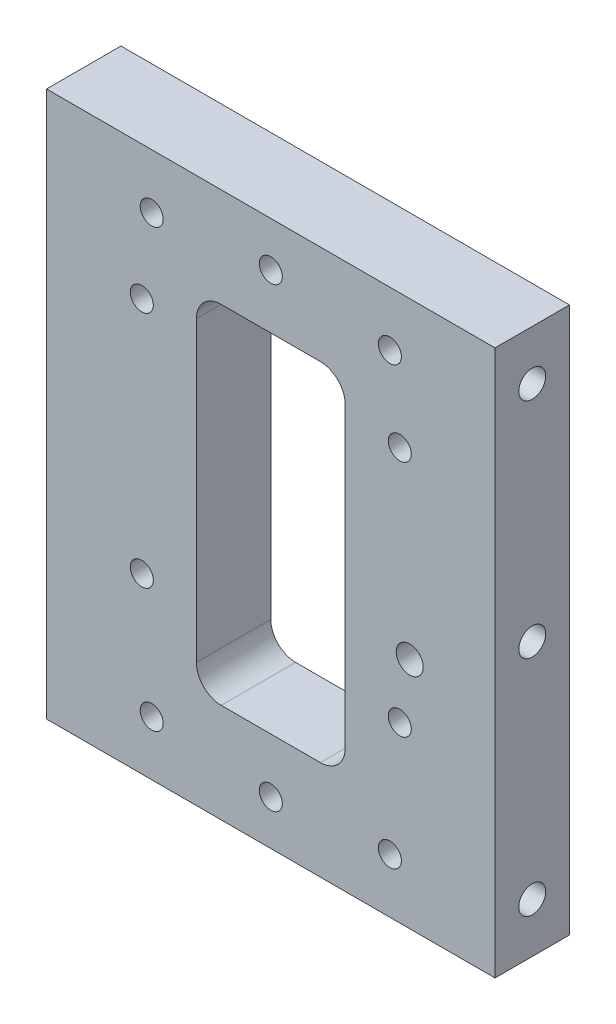
ISO-10303-21;
HEADER;
FILE_DESCRIPTION(('STEP AP214'),'2;1');
FILE_NAME('part.step','',(''),(''),'','','');
FILE_SCHEMA(('AUTOMOTIVE_DESIGN { 1 0 10303 214 1 1 1 1 }'));
ENDSEC;
DATA;
#1=APPLICATION_CONTEXT('core data for automotive mechanical design processes');
#2=APPLICATION_PROTOCOL_DEFINITION('international standard','automotive_design',2000,#1);
#3=PRODUCT_CONTEXT('',#1,'mechanical');
#4=PRODUCT('Part','Part','',(#3));
#5=PRODUCT_RELATED_PRODUCT_CATEGORY('part','',(#4));
#6=PRODUCT_DEFINITION_FORMATION('','',#4);
#7=PRODUCT_DEFINITION_CONTEXT('part definition',#1,'design');
#8=PRODUCT_DEFINITION('design','',#6,#7);
#9=PRODUCT_DEFINITION_SHAPE('','',#8);
#10=(LENGTH_UNIT() NAMED_UNIT(*) SI_UNIT(.MILLI.,.METRE.));
#11=(NAMED_UNIT(*) PLANE_ANGLE_UNIT() SI_UNIT($,.RADIAN.));
#12=(NAMED_UNIT(*) SI_UNIT($,.STERADIAN.) SOLID_ANGLE_UNIT());
#13=UNCERTAINTY_MEASURE_WITH_UNIT(LENGTH_MEASURE(1.E-05),#10,'distance_accuracy_value','');
#14=(GEOMETRIC_REPRESENTATION_CONTEXT(3) GLOBAL_UNCERTAINTY_ASSIGNED_CONTEXT((#13)) GLOBAL_UNIT_ASSIGNED_CONTEXT((#10,
#11,#12)) REPRESENTATION_CONTEXT('',''));
#15=CARTESIAN_POINT('',(0.,0.,0.));
#16=DIRECTION('',(0.,0.,1.));
#17=DIRECTION('',(1.,0.,0.));
#18=AXIS2_PLACEMENT_3D('',#15,#16,#17);
#19=CARTESIAN_POINT('',(-19.05,34.925,4.7625));
#20=DIRECTION('',(0.,-1.,0.));
#21=DIRECTION('',(0.,0.,-1.));
#22=AXIS2_PLACEMENT_3D('',#19,#20,#21);
#23=PLANE('',#22);
#24=DIRECTION('',(-1.,0.,0.));
#25=VECTOR('',#24,1.);
#26=CARTESIAN_POINT('',(-19.05,34.925,-4.7625));
#27=LINE('',#26,#25);
#28=CARTESIAN_POINT('',(28.702,34.925,-4.7625));
#29=VERTEX_POINT('',#28);
#30=CARTESIAN_POINT('',(-28.702,34.925,-4.7625));
#31=VERTEX_POINT('',#30);
#32=EDGE_CURVE('E274',#29,#31,#27,.T.);
#33=ORIENTED_EDGE('',*,*,#32,.T.);
#34=DIRECTION('',(0.,0.,-1.));
#35=VECTOR('',#34,1.);
#36=CARTESIAN_POINT('',(-28.702,34.925,76.4220178884145));
#37=LINE('',#36,#35);
#38=CARTESIAN_POINT('',(-28.702,34.925,4.7625));
#39=VERTEX_POINT('',#38);
#40=EDGE_CURVE('E207',#39,#31,#37,.T.);
#41=ORIENTED_EDGE('',*,*,#40,.F.);
#42=DIRECTION('',(-1.,0.,0.));
#43=VECTOR('',#42,1.);
#44=CARTESIAN_POINT('',(-19.05,34.925,4.7625));
#45=LINE('',#44,#43);
#46=CARTESIAN_POINT('',(28.702,34.925,4.7625));
#47=VERTEX_POINT('',#46);
#48=EDGE_CURVE('E275',#47,#39,#45,.T.);
#49=ORIENTED_EDGE('',*,*,#48,.F.);
#50=DIRECTION('',(0.,0.,-1.));
#51=VECTOR('',#50,1.);
#52=CARTESIAN_POINT('',(28.702,34.925,76.4220178884145));
#53=LINE('',#52,#51);
#54=EDGE_CURVE('E195',#47,#29,#53,.T.);
#55=ORIENTED_EDGE('',*,*,#54,.T.);
#56=EDGE_LOOP('',(#33,#41,#49,#55));
#57=FACE_BOUND('',#56,.T.);
#58=ADVANCED_FACE('F37',(#57),#23,.F.);
#59=CARTESIAN_POINT('',(-19.05,-34.925,4.7625));
#60=DIRECTION('',(0.,1.,0.));
#61=DIRECTION('',(0.,0.,1.));
#62=AXIS2_PLACEMENT_3D('',#59,#60,#61);
#63=PLANE('',#62);
#64=DIRECTION('',(1.,0.,0.));
#65=VECTOR('',#64,1.);
#66=CARTESIAN_POINT('',(-19.05,-34.925,4.7625));
#67=LINE('',#66,#65);
#68=CARTESIAN_POINT('',(-28.702,-34.925,4.7625));
#69=VERTEX_POINT('',#68);
#70=CARTESIAN_POINT('',(28.702,-34.925,4.7625));
#71=VERTEX_POINT('',#70);
#72=EDGE_CURVE('E277',#69,#71,#67,.T.);
#73=ORIENTED_EDGE('',*,*,#72,.F.);
#74=DIRECTION('',(0.,0.,-1.));
#75=VECTOR('',#74,1.);
#76=CARTESIAN_POINT('',(-28.702,-34.925,76.4220178884145));
#77=LINE('',#76,#75);
#78=CARTESIAN_POINT('',(-28.702,-34.925,-4.7625));
#79=VERTEX_POINT('',#78);
#80=EDGE_CURVE('E210',#69,#79,#77,.T.);
#81=ORIENTED_EDGE('',*,*,#80,.T.);
#82=DIRECTION('',(1.,0.,0.));
#83=VECTOR('',#82,1.);
#84=CARTESIAN_POINT('',(-19.05,-34.925,-4.7625));
#85=LINE('',#84,#83);
#86=CARTESIAN_POINT('',(28.702,-34.925,-4.7625));
#87=VERTEX_POINT('',#86);
#88=EDGE_CURVE('E278',#79,#87,#85,.T.);
#89=ORIENTED_EDGE('',*,*,#88,.T.);
#90=DIRECTION('',(0.,0.,-1.));
#91=VECTOR('',#90,1.);
#92=CARTESIAN_POINT('',(28.702,-34.925,76.4220178884145));
#93=LINE('',#92,#91);
#94=EDGE_CURVE('E198',#71,#87,#93,.T.);
#95=ORIENTED_EDGE('',*,*,#94,.F.);
#96=EDGE_LOOP('',(#73,#81,#89,#95));
#97=FACE_BOUND('',#96,.T.);
#98=ADVANCED_FACE('F373',(#97),#63,.F.);
#99=CARTESIAN_POINT('',(19.05,34.925,4.7625));
#100=DIRECTION('',(0.,0.,-1.));
#101=DIRECTION('',(-1.,0.,0.));
#102=AXIS2_PLACEMENT_3D('',#99,#100,#101);
#103=PLANE('',#102);
#104=CARTESIAN_POINT('',(17.78,-5.08,4.7625));
#105=DIRECTION('',(0.,0.,-1.));
#106=DIRECTION('',(-1.,0.,0.));
#107=AXIS2_PLACEMENT_3D('',#104,#105,#106);
#108=CIRCLE('',#107,1.7272);
#109=CARTESIAN_POINT('',(16.0528,-5.08,4.7625));
#110=VERTEX_POINT('',#109);
#111=EDGE_CURVE('E345',#110,#110,#108,.T.);
#112=ORIENTED_EDGE('',*,*,#111,.T.);
#113=EDGE_LOOP('',(#112));
#114=FACE_BOUND('',#113,.T.);
#115=DIRECTION('',(0.,-1.,0.));
#116=VECTOR('',#115,1.);
#117=CARTESIAN_POINT('',(9.525,22.225,4.7625));
#118=LINE('',#117,#116);
#119=CARTESIAN_POINT('',(9.525,19.05,4.7625));
#120=VERTEX_POINT('',#119);
#121=CARTESIAN_POINT('',(9.525,-19.05,4.7625));
#122=VERTEX_POINT('',#121);
#123=EDGE_CURVE('E331',#120,#122,#118,.T.);
#124=ORIENTED_EDGE('',*,*,#123,.T.);
#125=CARTESIAN_POINT('',(6.35,-19.05,4.7625));
#126=DIRECTION('',(0.,0.,-1.));
#127=DIRECTION('',(-1.,0.,0.));
#128=AXIS2_PLACEMENT_3D('',#125,#126,#127);
#129=CIRCLE('',#128,3.175);
#130=CARTESIAN_POINT('',(6.35,-22.225,4.7625));
#131=VERTEX_POINT('',#130);
#132=EDGE_CURVE('E303',#122,#131,#129,.T.);
#133=ORIENTED_EDGE('',*,*,#132,.T.);
#134=DIRECTION('',(-1.,0.,0.));
#135=VECTOR('',#134,1.);
#136=CARTESIAN_POINT('',(9.525,-22.225,4.7625));
#137=LINE('',#136,#135);
#138=CARTESIAN_POINT('',(-6.34999999999999,-22.225,4.7625));
#139=VERTEX_POINT('',#138);
#140=EDGE_CURVE('E160',#131,#139,#137,.T.);
#141=ORIENTED_EDGE('',*,*,#140,.T.);
#142=CARTESIAN_POINT('',(-6.35,-19.05,4.7625));
#143=DIRECTION('',(0.,0.,-1.));
#144=DIRECTION('',(-1.,0.,0.));
#145=AXIS2_PLACEMENT_3D('',#142,#143,#144);
#146=CIRCLE('',#145,3.175);
#147=CARTESIAN_POINT('',(-9.525,-19.05,4.7625));
#148=VERTEX_POINT('',#147);
#149=EDGE_CURVE('E307',#139,#148,#146,.T.);
#150=ORIENTED_EDGE('',*,*,#149,.T.);
#151=DIRECTION('',(0.,1.,0.));
#152=VECTOR('',#151,1.);
#153=CARTESIAN_POINT('',(-9.525,22.225,4.7625));
#154=LINE('',#153,#152);
#155=CARTESIAN_POINT('',(-9.525,19.05,4.7625));
#156=VERTEX_POINT('',#155);
#157=EDGE_CURVE('E340',#148,#156,#154,.T.);
#158=ORIENTED_EDGE('',*,*,#157,.T.);
#159=CARTESIAN_POINT('',(-6.35,19.05,4.7625));
#160=DIRECTION('',(0.,0.,-1.));
#161=DIRECTION('',(-1.,0.,0.));
#162=AXIS2_PLACEMENT_3D('',#159,#160,#161);
#163=CIRCLE('',#162,3.175);
#164=CARTESIAN_POINT('',(-6.34999999999999,22.225,4.7625));
#165=VERTEX_POINT('',#164);
#166=EDGE_CURVE('E59',#156,#165,#163,.T.);
#167=ORIENTED_EDGE('',*,*,#166,.T.);
#168=DIRECTION('',(1.,0.,0.));
#169=VECTOR('',#168,1.);
#170=CARTESIAN_POINT('',(9.525,22.225,4.7625));
#171=LINE('',#170,#169);
#172=CARTESIAN_POINT('',(6.35,22.225,4.7625));
#173=VERTEX_POINT('',#172);
#174=EDGE_CURVE('E333',#165,#173,#171,.T.);
#175=ORIENTED_EDGE('',*,*,#174,.T.);
#176=CARTESIAN_POINT('',(6.35,19.05,4.7625));
#177=DIRECTION('',(0.,0.,-1.));
#178=DIRECTION('',(-1.,0.,0.));
#179=AXIS2_PLACEMENT_3D('',#176,#177,#178);
#180=CIRCLE('',#179,3.175);
#181=EDGE_CURVE('E11',#173,#120,#180,.T.);
#182=ORIENTED_EDGE('',*,*,#181,.T.);
#183=EDGE_LOOP('',(#124,#133,#141,#150,#158,#167,#175,#182));
#184=FACE_BOUND('',#183,.T.);
#185=DIRECTION('',(0.,-1.,0.));
#186=VECTOR('',#185,1.);
#187=CARTESIAN_POINT('',(-28.702,-34.925,4.7625));
#188=LINE('',#187,#186);
#189=EDGE_CURVE('E203',#39,#69,#188,.T.);
#190=ORIENTED_EDGE('',*,*,#189,.T.);
#191=ORIENTED_EDGE('',*,*,#72,.T.);
#192=DIRECTION('',(0.,1.,0.));
#193=VECTOR('',#192,1.);
#194=CARTESIAN_POINT('',(28.702,-34.925,4.7625));
#195=LINE('',#194,#193);
#196=EDGE_CURVE('E191',#71,#47,#195,.T.);
#197=ORIENTED_EDGE('',*,*,#196,.T.);
#198=ORIENTED_EDGE('',*,*,#48,.T.);
#199=EDGE_LOOP('',(#190,#191,#197,#198));
#200=FACE_BOUND('',#199,.T.);
#201=CARTESIAN_POINT('',(0.,29.21,4.7625));
#202=DIRECTION('',(0.,0.,1.));
#203=DIRECTION('',(1.,0.,0.));
#204=AXIS2_PLACEMENT_3D('',#201,#202,#203);
#205=CIRCLE('',#204,1.47319999999999);
#206=CARTESIAN_POINT('',(1.47319999999999,29.21,4.7625));
#207=VERTEX_POINT('',#206);
#208=EDGE_CURVE('E206',#207,#207,#205,.T.);
#209=ORIENTED_EDGE('',*,*,#208,.F.);
#210=EDGE_LOOP('',(#209));
#211=FACE_BOUND('',#210,.T.);
#212=CARTESIAN_POINT('',(-15.24,27.94,4.7625));
#213=DIRECTION('',(0.,0.,1.));
#214=DIRECTION('',(1.,0.,0.));
#215=AXIS2_PLACEMENT_3D('',#212,#213,#214);
#216=CIRCLE('',#215,1.47319999999999);
#217=CARTESIAN_POINT('',(-13.7668,27.94,4.7625));
#218=VERTEX_POINT('',#217);
#219=EDGE_CURVE('E220',#218,#218,#216,.T.);
#220=ORIENTED_EDGE('',*,*,#219,.F.);
#221=EDGE_LOOP('',(#220));
#222=FACE_BOUND('',#221,.T.);
#223=CARTESIAN_POINT('',(15.24,27.94,4.7625));
#224=DIRECTION('',(0.,0.,1.));
#225=DIRECTION('',(1.,0.,0.));
#226=AXIS2_PLACEMENT_3D('',#223,#224,#225);
#227=CIRCLE('',#226,1.47319999999999);
#228=CARTESIAN_POINT('',(16.7132,27.94,4.7625));
#229=VERTEX_POINT('',#228);
#230=EDGE_CURVE('E226',#229,#229,#227,.T.);
#231=ORIENTED_EDGE('',*,*,#230,.F.);
#232=EDGE_LOOP('',(#231));
#233=FACE_BOUND('',#232,.T.);
#234=CARTESIAN_POINT('',(-15.24,-27.94,4.7625));
#235=DIRECTION('',(0.,0.,1.));
#236=DIRECTION('',(1.,0.,0.));
#237=AXIS2_PLACEMENT_3D('',#234,#235,#236);
#238=CIRCLE('',#237,1.47319999999999);
#239=CARTESIAN_POINT('',(-13.7668,-27.94,4.7625));
#240=VERTEX_POINT('',#239);
#241=EDGE_CURVE('E232',#240,#240,#238,.T.);
#242=ORIENTED_EDGE('',*,*,#241,.F.);
#243=EDGE_LOOP('',(#242));
#244=FACE_BOUND('',#243,.T.);
#245=CARTESIAN_POINT('',(15.24,-27.94,4.7625));
#246=DIRECTION('',(0.,0.,1.));
#247=DIRECTION('',(1.,0.,0.));
#248=AXIS2_PLACEMENT_3D('',#245,#246,#247);
#249=CIRCLE('',#248,1.47319999999999);
#250=CARTESIAN_POINT('',(16.7132,-27.94,4.7625));
#251=VERTEX_POINT('',#250);
#252=EDGE_CURVE('E238',#251,#251,#249,.T.);
#253=ORIENTED_EDGE('',*,*,#252,.F.);
#254=EDGE_LOOP('',(#253));
#255=FACE_BOUND('',#254,.T.);
#256=CARTESIAN_POINT('',(-16.51,17.78,4.7625));
#257=DIRECTION('',(0.,0.,1.));
#258=DIRECTION('',(1.,0.,0.));
#259=AXIS2_PLACEMENT_3D('',#256,#257,#258);
#260=CIRCLE('',#259,1.47319999999999);
#261=CARTESIAN_POINT('',(-15.0368,17.78,4.7625));
#262=VERTEX_POINT('',#261);
#263=EDGE_CURVE('E244',#262,#262,#260,.T.);
#264=ORIENTED_EDGE('',*,*,#263,.F.);
#265=EDGE_LOOP('',(#264));
#266=FACE_BOUND('',#265,.T.);
#267=CARTESIAN_POINT('',(-16.51,-12.7,4.7625));
#268=DIRECTION('',(0.,0.,1.));
#269=DIRECTION('',(1.,0.,0.));
#270=AXIS2_PLACEMENT_3D('',#267,#268,#269);
#271=CIRCLE('',#270,1.47319999999999);
#272=CARTESIAN_POINT('',(-15.0368,-12.7,4.7625));
#273=VERTEX_POINT('',#272);
#274=EDGE_CURVE('E250',#273,#273,#271,.T.);
#275=ORIENTED_EDGE('',*,*,#274,.F.);
#276=EDGE_LOOP('',(#275));
#277=FACE_BOUND('',#276,.T.);
#278=CARTESIAN_POINT('',(16.51,17.78,4.7625));
#279=DIRECTION('',(0.,0.,1.));
#280=DIRECTION('',(1.,0.,0.));
#281=AXIS2_PLACEMENT_3D('',#278,#279,#280);
#282=CIRCLE('',#281,1.47319999999999);
#283=CARTESIAN_POINT('',(17.9832,17.78,4.7625));
#284=VERTEX_POINT('',#283);
#285=EDGE_CURVE('E256',#284,#284,#282,.T.);
#286=ORIENTED_EDGE('',*,*,#285,.F.);
#287=EDGE_LOOP('',(#286));
#288=FACE_BOUND('',#287,.T.);
#289=CARTESIAN_POINT('',(16.51,-12.7,4.7625));
#290=DIRECTION('',(0.,0.,1.));
#291=DIRECTION('',(1.,0.,0.));
#292=AXIS2_PLACEMENT_3D('',#289,#290,#291);
#293=CIRCLE('',#292,1.47319999999999);
#294=CARTESIAN_POINT('',(17.9832,-12.7,4.7625));
#295=VERTEX_POINT('',#294);
#296=EDGE_CURVE('E262',#295,#295,#293,.T.);
#297=ORIENTED_EDGE('',*,*,#296,.F.);
#298=EDGE_LOOP('',(#297));
#299=FACE_BOUND('',#298,.T.);
#300=CARTESIAN_POINT('',(0.,-29.21,4.7625));
#301=DIRECTION('',(0.,0.,1.));
#302=DIRECTION('',(1.,0.,0.));
#303=AXIS2_PLACEMENT_3D('',#300,#301,#302);
#304=CIRCLE('',#303,1.47319999999999);
#305=CARTESIAN_POINT('',(1.47319999999999,-29.21,4.7625));
#306=VERTEX_POINT('',#305);
#307=EDGE_CURVE('E268',#306,#306,#304,.T.);
#308=ORIENTED_EDGE('',*,*,#307,.F.);
#309=EDGE_LOOP('',(#308));
#310=FACE_BOUND('',#309,.T.);
#311=ADVANCED_FACE('F329',(#114,#184,#200,#211,#222,#233,#244,#255,#266,#277,#288,#299,#310),
#103,.F.);
#312=CARTESIAN_POINT('',(19.05,34.925,-4.7625));
#313=DIRECTION('',(0.,0.,-1.));
#314=DIRECTION('',(-1.,0.,0.));
#315=AXIS2_PLACEMENT_3D('',#312,#313,#314);
#316=PLANE('',#315);
#317=CARTESIAN_POINT('',(17.78,-5.08,-4.7625));
#318=DIRECTION('',(0.,0.,-1.));
#319=DIRECTION('',(-1.,0.,0.));
#320=AXIS2_PLACEMENT_3D('',#317,#318,#319);
#321=CIRCLE('',#320,1.72719999999999);
#322=CARTESIAN_POINT('',(16.0528,-5.08,-4.7625));
#323=VERTEX_POINT('',#322);
#324=EDGE_CURVE('E356',#323,#323,#321,.T.);
#325=ORIENTED_EDGE('',*,*,#324,.F.);
#326=EDGE_LOOP('',(#325));
#327=FACE_BOUND('',#326,.T.);
#328=DIRECTION('',(0.,1.,0.));
#329=VECTOR('',#328,1.);
#330=CARTESIAN_POINT('',(-9.525,22.225,-4.7625));
#331=LINE('',#330,#329);
#332=CARTESIAN_POINT('',(-9.525,-19.05,-4.7625));
#333=VERTEX_POINT('',#332);
#334=CARTESIAN_POINT('',(-9.525,19.05,-4.7625));
#335=VERTEX_POINT('',#334);
#336=EDGE_CURVE('E324',#333,#335,#331,.T.);
#337=ORIENTED_EDGE('',*,*,#336,.F.);
#338=CARTESIAN_POINT('',(-6.35,-19.05,-4.7625));
#339=DIRECTION('',(0.,0.,-1.));
#340=DIRECTION('',(-1.,0.,0.));
#341=AXIS2_PLACEMENT_3D('',#338,#339,#340);
#342=CIRCLE('',#341,3.175);
#343=CARTESIAN_POINT('',(-6.34999999999999,-22.225,-4.7625));
#344=VERTEX_POINT('',#343);
#345=EDGE_CURVE('E305',#333,#344,#342,.F.);
#346=ORIENTED_EDGE('',*,*,#345,.T.);
#347=DIRECTION('',(-1.,0.,0.));
#348=VECTOR('',#347,1.);
#349=CARTESIAN_POINT('',(9.525,-22.225,-4.7625));
#350=LINE('',#349,#348);
#351=CARTESIAN_POINT('',(6.35,-22.225,-4.7625));
#352=VERTEX_POINT('',#351);
#353=EDGE_CURVE('E347',#352,#344,#350,.T.);
#354=ORIENTED_EDGE('',*,*,#353,.F.);
#355=CARTESIAN_POINT('',(6.35,-19.05,-4.7625));
#356=DIRECTION('',(0.,0.,-1.));
#357=DIRECTION('',(-1.,0.,0.));
#358=AXIS2_PLACEMENT_3D('',#355,#356,#357);
#359=CIRCLE('',#358,3.175);
#360=CARTESIAN_POINT('',(9.525,-19.05,-4.7625));
#361=VERTEX_POINT('',#360);
#362=EDGE_CURVE('E301',#352,#361,#359,.F.);
#363=ORIENTED_EDGE('',*,*,#362,.T.);
#364=DIRECTION('',(0.,-1.,0.));
#365=VECTOR('',#364,1.);
#366=CARTESIAN_POINT('',(9.525,22.225,-4.7625));
#367=LINE('',#366,#365);
#368=CARTESIAN_POINT('',(9.525,19.05,-4.7625));
#369=VERTEX_POINT('',#368);
#370=EDGE_CURVE('E319',#369,#361,#367,.T.);
#371=ORIENTED_EDGE('',*,*,#370,.F.);
#372=CARTESIAN_POINT('',(6.35,19.05,-4.7625));
#373=DIRECTION('',(0.,0.,-1.));
#374=DIRECTION('',(-1.,0.,0.));
#375=AXIS2_PLACEMENT_3D('',#372,#373,#374);
#376=CIRCLE('',#375,3.175);
#377=CARTESIAN_POINT('',(6.35,22.225,-4.7625));
#378=VERTEX_POINT('',#377);
#379=EDGE_CURVE('E45',#369,#378,#376,.F.);
#380=ORIENTED_EDGE('',*,*,#379,.T.);
#381=DIRECTION('',(1.,0.,0.));
#382=VECTOR('',#381,1.);
#383=CARTESIAN_POINT('',(9.525,22.225,-4.7625));
#384=LINE('',#383,#382);
#385=CARTESIAN_POINT('',(-6.34999999999999,22.225,-4.7625));
#386=VERTEX_POINT('',#385);
#387=EDGE_CURVE('E317',#386,#378,#384,.T.);
#388=ORIENTED_EDGE('',*,*,#387,.F.);
#389=CARTESIAN_POINT('',(-6.35,19.05,-4.7625));
#390=DIRECTION('',(0.,0.,-1.));
#391=DIRECTION('',(-1.,0.,0.));
#392=AXIS2_PLACEMENT_3D('',#389,#390,#391);
#393=CIRCLE('',#392,3.175);
#394=EDGE_CURVE('E309',#386,#335,#393,.F.);
#395=ORIENTED_EDGE('',*,*,#394,.T.);
#396=EDGE_LOOP('',(#337,#346,#354,#363,#371,#380,#388,#395));
#397=FACE_BOUND('',#396,.T.);
#398=DIRECTION('',(0.,-1.,0.));
#399=VECTOR('',#398,1.);
#400=CARTESIAN_POINT('',(28.702,-34.925,-4.7625));
#401=LINE('',#400,#399);
#402=EDGE_CURVE('E190',#29,#87,#401,.T.);
#403=ORIENTED_EDGE('',*,*,#402,.T.);
#404=ORIENTED_EDGE('',*,*,#88,.F.);
#405=DIRECTION('',(0.,1.,0.));
#406=VECTOR('',#405,1.);
#407=CARTESIAN_POINT('',(-28.702,-34.925,-4.7625));
#408=LINE('',#407,#406);
#409=EDGE_CURVE('E194',#79,#31,#408,.T.);
#410=ORIENTED_EDGE('',*,*,#409,.T.);
#411=ORIENTED_EDGE('',*,*,#32,.F.);
#412=EDGE_LOOP('',(#403,#404,#410,#411));
#413=FACE_BOUND('',#412,.T.);
#414=CARTESIAN_POINT('',(0.,29.21,-4.7625));
#415=DIRECTION('',(0.,0.,1.));
#416=DIRECTION('',(1.,0.,0.));
#417=AXIS2_PLACEMENT_3D('',#414,#415,#416);
#418=CIRCLE('',#417,1.4732);
#419=CARTESIAN_POINT('',(1.4732,29.21,-4.7625));
#420=VERTEX_POINT('',#419);
#421=EDGE_CURVE('E217',#420,#420,#418,.T.);
#422=ORIENTED_EDGE('',*,*,#421,.T.);
#423=EDGE_LOOP('',(#422));
#424=FACE_BOUND('',#423,.T.);
#425=CARTESIAN_POINT('',(-15.24,27.94,-4.7625));
#426=DIRECTION('',(0.,0.,1.));
#427=DIRECTION('',(1.,0.,0.));
#428=AXIS2_PLACEMENT_3D('',#425,#426,#427);
#429=CIRCLE('',#428,1.4732);
#430=CARTESIAN_POINT('',(-13.7668,27.94,-4.7625));
#431=VERTEX_POINT('',#430);
#432=EDGE_CURVE('E223',#431,#431,#429,.T.);
#433=ORIENTED_EDGE('',*,*,#432,.T.);
#434=EDGE_LOOP('',(#433));
#435=FACE_BOUND('',#434,.T.);
#436=CARTESIAN_POINT('',(15.24,27.94,-4.7625));
#437=DIRECTION('',(0.,0.,1.));
#438=DIRECTION('',(1.,0.,0.));
#439=AXIS2_PLACEMENT_3D('',#436,#437,#438);
#440=CIRCLE('',#439,1.4732);
#441=CARTESIAN_POINT('',(16.7132,27.94,-4.7625));
#442=VERTEX_POINT('',#441);
#443=EDGE_CURVE('E229',#442,#442,#440,.T.);
#444=ORIENTED_EDGE('',*,*,#443,.T.);
#445=EDGE_LOOP('',(#444));
#446=FACE_BOUND('',#445,.T.);
#447=CARTESIAN_POINT('',(-15.24,-27.94,-4.7625));
#448=DIRECTION('',(0.,0.,1.));
#449=DIRECTION('',(1.,0.,0.));
#450=AXIS2_PLACEMENT_3D('',#447,#448,#449);
#451=CIRCLE('',#450,1.4732);
#452=CARTESIAN_POINT('',(-13.7668,-27.94,-4.7625));
#453=VERTEX_POINT('',#452);
#454=EDGE_CURVE('E235',#453,#453,#451,.T.);
#455=ORIENTED_EDGE('',*,*,#454,.T.);
#456=EDGE_LOOP('',(#455));
#457=FACE_BOUND('',#456,.T.);
#458=CARTESIAN_POINT('',(15.24,-27.94,-4.7625));
#459=DIRECTION('',(0.,0.,1.));
#460=DIRECTION('',(1.,0.,0.));
#461=AXIS2_PLACEMENT_3D('',#458,#459,#460);
#462=CIRCLE('',#461,1.4732);
#463=CARTESIAN_POINT('',(16.7132,-27.94,-4.7625));
#464=VERTEX_POINT('',#463);
#465=EDGE_CURVE('E241',#464,#464,#462,.T.);
#466=ORIENTED_EDGE('',*,*,#465,.T.);
#467=EDGE_LOOP('',(#466));
#468=FACE_BOUND('',#467,.T.);
#469=CARTESIAN_POINT('',(-16.51,17.78,-4.7625));
#470=DIRECTION('',(0.,0.,1.));
#471=DIRECTION('',(1.,0.,0.));
#472=AXIS2_PLACEMENT_3D('',#469,#470,#471);
#473=CIRCLE('',#472,1.4732);
#474=CARTESIAN_POINT('',(-15.0368,17.78,-4.7625));
#475=VERTEX_POINT('',#474);
#476=EDGE_CURVE('E247',#475,#475,#473,.T.);
#477=ORIENTED_EDGE('',*,*,#476,.T.);
#478=EDGE_LOOP('',(#477));
#479=FACE_BOUND('',#478,.T.);
#480=CARTESIAN_POINT('',(-16.51,-12.7,-4.7625));
#481=DIRECTION('',(0.,0.,1.));
#482=DIRECTION('',(1.,0.,0.));
#483=AXIS2_PLACEMENT_3D('',#480,#481,#482);
#484=CIRCLE('',#483,1.4732);
#485=CARTESIAN_POINT('',(-15.0368,-12.7,-4.7625));
#486=VERTEX_POINT('',#485);
#487=EDGE_CURVE('E253',#486,#486,#484,.T.);
#488=ORIENTED_EDGE('',*,*,#487,.T.);
#489=EDGE_LOOP('',(#488));
#490=FACE_BOUND('',#489,.T.);
#491=CARTESIAN_POINT('',(16.51,17.78,-4.7625));
#492=DIRECTION('',(0.,0.,1.));
#493=DIRECTION('',(1.,0.,0.));
#494=AXIS2_PLACEMENT_3D('',#491,#492,#493);
#495=CIRCLE('',#494,1.4732);
#496=CARTESIAN_POINT('',(17.9832,17.78,-4.7625));
#497=VERTEX_POINT('',#496);
#498=EDGE_CURVE('E259',#497,#497,#495,.T.);
#499=ORIENTED_EDGE('',*,*,#498,.T.);
#500=EDGE_LOOP('',(#499));
#501=FACE_BOUND('',#500,.T.);
#502=CARTESIAN_POINT('',(16.51,-12.7,-4.7625));
#503=DIRECTION('',(0.,0.,1.));
#504=DIRECTION('',(1.,0.,0.));
#505=AXIS2_PLACEMENT_3D('',#502,#503,#504);
#506=CIRCLE('',#505,1.4732);
#507=CARTESIAN_POINT('',(17.9832,-12.7,-4.7625));
#508=VERTEX_POINT('',#507);
#509=EDGE_CURVE('E265',#508,#508,#506,.T.);
#510=ORIENTED_EDGE('',*,*,#509,.T.);
#511=EDGE_LOOP('',(#510));
#512=FACE_BOUND('',#511,.T.);
#513=CARTESIAN_POINT('',(0.,-29.21,-4.7625));
#514=DIRECTION('',(0.,0.,1.));
#515=DIRECTION('',(1.,0.,0.));
#516=AXIS2_PLACEMENT_3D('',#513,#514,#515);
#517=CIRCLE('',#516,1.4732);
#518=CARTESIAN_POINT('',(1.4732,-29.21,-4.7625));
#519=VERTEX_POINT('',#518);
#520=EDGE_CURVE('E271',#519,#519,#517,.T.);
#521=ORIENTED_EDGE('',*,*,#520,.T.);
#522=EDGE_LOOP('',(#521));
#523=FACE_BOUND('',#522,.T.);
#524=ADVANCED_FACE('F315',(#327,#397,#413,#424,#435,#446,#457,#468,#479,#490,#501,#512,#523),
#316,.T.);
#525=CARTESIAN_POINT('',(0.,-29.21,4.7625));
#526=DIRECTION('',(0.,0.,1.));
#527=DIRECTION('',(1.,0.,0.));
#528=AXIS2_PLACEMENT_3D('',#525,#526,#527);
#529=CYLINDRICAL_SURFACE('',#528,1.47319999999999);
#530=ORIENTED_EDGE('',*,*,#520,.F.);
#531=EDGE_LOOP('',(#530));
#532=FACE_BOUND('',#531,.T.);
#533=ORIENTED_EDGE('',*,*,#307,.T.);
#534=EDGE_LOOP('',(#533));
#535=FACE_BOUND('',#534,.T.);
#536=ADVANCED_FACE('F363',(#532,#535),#529,.F.);
#537=CARTESIAN_POINT('',(16.51,-12.7,4.7625));
#538=DIRECTION('',(0.,0.,1.));
#539=DIRECTION('',(1.,0.,0.));
#540=AXIS2_PLACEMENT_3D('',#537,#538,#539);
#541=CYLINDRICAL_SURFACE('',#540,1.47319999999999);
#542=ORIENTED_EDGE('',*,*,#509,.F.);
#543=EDGE_LOOP('',(#542));
#544=FACE_BOUND('',#543,.T.);
#545=ORIENTED_EDGE('',*,*,#296,.T.);
#546=EDGE_LOOP('',(#545));
#547=FACE_BOUND('',#546,.T.);
#548=ADVANCED_FACE('F370',(#544,#547),#541,.F.);
#549=CARTESIAN_POINT('',(16.51,17.78,4.7625));
#550=DIRECTION('',(0.,0.,1.));
#551=DIRECTION('',(1.,0.,0.));
#552=AXIS2_PLACEMENT_3D('',#549,#550,#551);
#553=CYLINDRICAL_SURFACE('',#552,1.47319999999999);
#554=ORIENTED_EDGE('',*,*,#498,.F.);
#555=EDGE_LOOP('',(#554));
#556=FACE_BOUND('',#555,.T.);
#557=ORIENTED_EDGE('',*,*,#285,.T.);
#558=EDGE_LOOP('',(#557));
#559=FACE_BOUND('',#558,.T.);
#560=ADVANCED_FACE('F494',(#556,#559),#553,.F.);
#561=CARTESIAN_POINT('',(-16.51,-12.7,4.7625));
#562=DIRECTION('',(0.,0.,1.));
#563=DIRECTION('',(1.,0.,0.));
#564=AXIS2_PLACEMENT_3D('',#561,#562,#563);
#565=CYLINDRICAL_SURFACE('',#564,1.47319999999999);
#566=ORIENTED_EDGE('',*,*,#487,.F.);
#567=EDGE_LOOP('',(#566));
#568=FACE_BOUND('',#567,.T.);
#569=ORIENTED_EDGE('',*,*,#274,.T.);
#570=EDGE_LOOP('',(#569));
#571=FACE_BOUND('',#570,.T.);
#572=ADVANCED_FACE('F490',(#568,#571),#565,.F.);
#573=CARTESIAN_POINT('',(-16.51,17.78,4.7625));
#574=DIRECTION('',(0.,0.,1.));
#575=DIRECTION('',(1.,0.,0.));
#576=AXIS2_PLACEMENT_3D('',#573,#574,#575);
#577=CYLINDRICAL_SURFACE('',#576,1.47319999999999);
#578=ORIENTED_EDGE('',*,*,#476,.F.);
#579=EDGE_LOOP('',(#578));
#580=FACE_BOUND('',#579,.T.);
#581=ORIENTED_EDGE('',*,*,#263,.T.);
#582=EDGE_LOOP('',(#581));
#583=FACE_BOUND('',#582,.T.);
#584=ADVANCED_FACE('F486',(#580,#583),#577,.F.);
#585=CARTESIAN_POINT('',(15.24,-27.94,4.7625));
#586=DIRECTION('',(0.,0.,1.));
#587=DIRECTION('',(1.,0.,0.));
#588=AXIS2_PLACEMENT_3D('',#585,#586,#587);
#589=CYLINDRICAL_SURFACE('',#588,1.47319999999999);
#590=ORIENTED_EDGE('',*,*,#465,.F.);
#591=EDGE_LOOP('',(#590));
#592=FACE_BOUND('',#591,.T.);
#593=ORIENTED_EDGE('',*,*,#252,.T.);
#594=EDGE_LOOP('',(#593));
#595=FACE_BOUND('',#594,.T.);
#596=ADVANCED_FACE('F482',(#592,#595),#589,.F.);
#597=CARTESIAN_POINT('',(-15.24,-27.94,4.7625));
#598=DIRECTION('',(0.,0.,1.));
#599=DIRECTION('',(1.,0.,0.));
#600=AXIS2_PLACEMENT_3D('',#597,#598,#599);
#601=CYLINDRICAL_SURFACE('',#600,1.47319999999999);
#602=ORIENTED_EDGE('',*,*,#454,.F.);
#603=EDGE_LOOP('',(#602));
#604=FACE_BOUND('',#603,.T.);
#605=ORIENTED_EDGE('',*,*,#241,.T.);
#606=EDGE_LOOP('',(#605));
#607=FACE_BOUND('',#606,.T.);
#608=ADVANCED_FACE('F478',(#604,#607),#601,.F.);
#609=CARTESIAN_POINT('',(15.24,27.94,4.7625));
#610=DIRECTION('',(0.,0.,1.));
#611=DIRECTION('',(1.,0.,0.));
#612=AXIS2_PLACEMENT_3D('',#609,#610,#611);
#613=CYLINDRICAL_SURFACE('',#612,1.47319999999999);
#614=ORIENTED_EDGE('',*,*,#443,.F.);
#615=EDGE_LOOP('',(#614));
#616=FACE_BOUND('',#615,.T.);
#617=ORIENTED_EDGE('',*,*,#230,.T.);
#618=EDGE_LOOP('',(#617));
#619=FACE_BOUND('',#618,.T.);
#620=ADVANCED_FACE('F474',(#616,#619),#613,.F.);
#621=CARTESIAN_POINT('',(-15.24,27.94,4.7625));
#622=DIRECTION('',(0.,0.,1.));
#623=DIRECTION('',(1.,0.,0.));
#624=AXIS2_PLACEMENT_3D('',#621,#622,#623);
#625=CYLINDRICAL_SURFACE('',#624,1.47319999999999);
#626=ORIENTED_EDGE('',*,*,#432,.F.);
#627=EDGE_LOOP('',(#626));
#628=FACE_BOUND('',#627,.T.);
#629=ORIENTED_EDGE('',*,*,#219,.T.);
#630=EDGE_LOOP('',(#629));
#631=FACE_BOUND('',#630,.T.);
#632=ADVANCED_FACE('F470',(#628,#631),#625,.F.);
#633=CARTESIAN_POINT('',(0.,29.21,4.7625));
#634=DIRECTION('',(0.,0.,1.));
#635=DIRECTION('',(1.,0.,0.));
#636=AXIS2_PLACEMENT_3D('',#633,#634,#635);
#637=CYLINDRICAL_SURFACE('',#636,1.47319999999999);
#638=ORIENTED_EDGE('',*,*,#421,.F.);
#639=EDGE_LOOP('',(#638));
#640=FACE_BOUND('',#639,.T.);
#641=ORIENTED_EDGE('',*,*,#208,.T.);
#642=EDGE_LOOP('',(#641));
#643=FACE_BOUND('',#642,.T.);
#644=ADVANCED_FACE('F466',(#640,#643),#637,.F.);
#645=CARTESIAN_POINT('',(-28.702,-34.925,76.4220178884145));
#646=DIRECTION('',(-1.,0.,0.));
#647=DIRECTION('',(0.,0.,1.));
#648=AXIS2_PLACEMENT_3D('',#645,#646,#647);
#649=PLANE('',#648);
#650=CARTESIAN_POINT('',(-28.702,0.,0.));
#651=DIRECTION('',(-1.,0.,0.));
#652=DIRECTION('',(0.,0.,1.));
#653=AXIS2_PLACEMENT_3D('',#650,#651,#652);
#654=CIRCLE('',#653,1.7272);
#655=CARTESIAN_POINT('',(-28.702,0.,1.7272));
#656=VERTEX_POINT('',#655);
#657=EDGE_CURVE('E154',#656,#656,#654,.T.);
#658=ORIENTED_EDGE('',*,*,#657,.F.);
#659=EDGE_LOOP('',(#658));
#660=FACE_BOUND('',#659,.T.);
#661=CARTESIAN_POINT('',(-28.702,28.575,0.));
#662=DIRECTION('',(-1.,0.,0.));
#663=DIRECTION('',(0.,0.,1.));
#664=AXIS2_PLACEMENT_3D('',#661,#662,#663);
#665=CIRCLE('',#664,1.7272);
#666=CARTESIAN_POINT('',(-28.702,28.575,1.72720000000001));
#667=VERTEX_POINT('',#666);
#668=EDGE_CURVE('E153',#667,#667,#665,.T.);
#669=ORIENTED_EDGE('',*,*,#668,.F.);
#670=EDGE_LOOP('',(#669));
#671=FACE_BOUND('',#670,.T.);
#672=CARTESIAN_POINT('',(-28.702,-28.575,0.));
#673=DIRECTION('',(-1.,0.,0.));
#674=DIRECTION('',(0.,0.,1.));
#675=AXIS2_PLACEMENT_3D('',#672,#673,#674);
#676=CIRCLE('',#675,1.7272);
#677=CARTESIAN_POINT('',(-28.702,-28.575,1.72719999999999));
#678=VERTEX_POINT('',#677);
#679=EDGE_CURVE('E166',#678,#678,#676,.T.);
#680=ORIENTED_EDGE('',*,*,#679,.F.);
#681=EDGE_LOOP('',(#680));
#682=FACE_BOUND('',#681,.T.);
#683=ORIENTED_EDGE('',*,*,#189,.F.);
#684=ORIENTED_EDGE('',*,*,#40,.T.);
#685=ORIENTED_EDGE('',*,*,#409,.F.);
#686=ORIENTED_EDGE('',*,*,#80,.F.);
#687=EDGE_LOOP('',(#683,#684,#685,#686));
#688=FACE_BOUND('',#687,.T.);
#689=ADVANCED_FACE('F462',(#660,#671,#682,#688),#649,.T.);
#690=CARTESIAN_POINT('',(28.702,-34.925,76.4220178884145));
#691=DIRECTION('',(1.,0.,0.));
#692=DIRECTION('',(0.,0.,-1.));
#693=AXIS2_PLACEMENT_3D('',#690,#691,#692);
#694=PLANE('',#693);
#695=CARTESIAN_POINT('',(28.702,0.,0.));
#696=DIRECTION('',(1.,0.,0.));
#697=DIRECTION('',(0.,0.,-1.));
#698=AXIS2_PLACEMENT_3D('',#695,#696,#697);
#699=CIRCLE('',#698,1.7272);
#700=CARTESIAN_POINT('',(28.702,0.,-1.7272));
#701=VERTEX_POINT('',#700);
#702=EDGE_CURVE('E172',#701,#701,#699,.T.);
#703=ORIENTED_EDGE('',*,*,#702,.F.);
#704=EDGE_LOOP('',(#703));
#705=FACE_BOUND('',#704,.T.);
#706=CARTESIAN_POINT('',(28.702,28.575,0.));
#707=DIRECTION('',(1.,0.,0.));
#708=DIRECTION('',(0.,0.,-1.));
#709=AXIS2_PLACEMENT_3D('',#706,#707,#708);
#710=CIRCLE('',#709,1.7272);
#711=CARTESIAN_POINT('',(28.702,28.575,-1.72719999999999));
#712=VERTEX_POINT('',#711);
#713=EDGE_CURVE('E178',#712,#712,#710,.T.);
#714=ORIENTED_EDGE('',*,*,#713,.F.);
#715=EDGE_LOOP('',(#714));
#716=FACE_BOUND('',#715,.T.);
#717=CARTESIAN_POINT('',(28.702,-28.575,0.));
#718=DIRECTION('',(1.,0.,0.));
#719=DIRECTION('',(0.,0.,-1.));
#720=AXIS2_PLACEMENT_3D('',#717,#718,#719);
#721=CIRCLE('',#720,1.7272);
#722=CARTESIAN_POINT('',(28.702,-28.575,-1.7272));
#723=VERTEX_POINT('',#722);
#724=EDGE_CURVE('E184',#723,#723,#721,.T.);
#725=ORIENTED_EDGE('',*,*,#724,.F.);
#726=EDGE_LOOP('',(#725));
#727=FACE_BOUND('',#726,.T.);
#728=ORIENTED_EDGE('',*,*,#196,.F.);
#729=ORIENTED_EDGE('',*,*,#94,.T.);
#730=ORIENTED_EDGE('',*,*,#402,.F.);
#731=ORIENTED_EDGE('',*,*,#54,.F.);
#732=EDGE_LOOP('',(#728,#729,#730,#731));
#733=FACE_BOUND('',#732,.T.);
#734=ADVANCED_FACE('F458',(#705,#716,#727,#733),#694,.T.);
#735=CARTESIAN_POINT('',(19.177,-28.575,0.));
#736=DIRECTION('',(1.,0.,0.));
#737=DIRECTION('',(0.,0.,-1.));
#738=AXIS2_PLACEMENT_3D('',#735,#736,#737);
#739=CONICAL_SURFACE('',#738,1.7272,1.02974425867665);
#740=CARTESIAN_POINT('',(18.1391935388156,-28.575,0.));
#741=VERTEX_POINT('',#740);
#742=VERTEX_LOOP('',#741);
#743=FACE_BOUND('',#742,.T.);
#744=CARTESIAN_POINT('',(19.177,-28.575,0.));
#745=DIRECTION('',(1.,0.,0.));
#746=DIRECTION('',(0.,0.,-1.));
#747=AXIS2_PLACEMENT_3D('',#744,#745,#746);
#748=CIRCLE('',#747,1.7272);
#749=CARTESIAN_POINT('',(19.177,-28.575,-1.7272));
#750=VERTEX_POINT('',#749);
#751=EDGE_CURVE('E187',#750,#750,#748,.T.);
#752=ORIENTED_EDGE('',*,*,#751,.T.);
#753=EDGE_LOOP('',(#752));
#754=FACE_BOUND('',#753,.T.);
#755=ADVANCED_FACE('F454',(#743,#754),#739,.F.);
#756=CARTESIAN_POINT('',(28.702,-28.575,0.));
#757=DIRECTION('',(1.,0.,0.));
#758=DIRECTION('',(0.,0.,-1.));
#759=AXIS2_PLACEMENT_3D('',#756,#757,#758);
#760=CYLINDRICAL_SURFACE('',#759,1.7272);
#761=ORIENTED_EDGE('',*,*,#751,.F.);
#762=EDGE_LOOP('',(#761));
#763=FACE_BOUND('',#762,.T.);
#764=ORIENTED_EDGE('',*,*,#724,.T.);
#765=EDGE_LOOP('',(#764));
#766=FACE_BOUND('',#765,.T.);
#767=ADVANCED_FACE('F450',(#763,#766),#760,.F.);
#768=CARTESIAN_POINT('',(19.177,28.575,0.));
#769=DIRECTION('',(1.,0.,0.));
#770=DIRECTION('',(0.,0.,-1.));
#771=AXIS2_PLACEMENT_3D('',#768,#769,#770);
#772=CONICAL_SURFACE('',#771,1.7272,1.02974425867665);
#773=CARTESIAN_POINT('',(18.1391935388156,28.575,0.));
#774=VERTEX_POINT('',#773);
#775=VERTEX_LOOP('',#774);
#776=FACE_BOUND('',#775,.T.);
#777=CARTESIAN_POINT('',(19.177,28.575,0.));
#778=DIRECTION('',(1.,0.,0.));
#779=DIRECTION('',(0.,0.,-1.));
#780=AXIS2_PLACEMENT_3D('',#777,#778,#779);
#781=CIRCLE('',#780,1.7272);
#782=CARTESIAN_POINT('',(19.177,28.575,-1.72719999999999));
#783=VERTEX_POINT('',#782);
#784=EDGE_CURVE('E181',#783,#783,#781,.T.);
#785=ORIENTED_EDGE('',*,*,#784,.T.);
#786=EDGE_LOOP('',(#785));
#787=FACE_BOUND('',#786,.T.);
#788=ADVANCED_FACE('F446',(#776,#787),#772,.F.);
#789=CARTESIAN_POINT('',(28.702,28.575,0.));
#790=DIRECTION('',(1.,0.,0.));
#791=DIRECTION('',(0.,0.,-1.));
#792=AXIS2_PLACEMENT_3D('',#789,#790,#791);
#793=CYLINDRICAL_SURFACE('',#792,1.7272);
#794=ORIENTED_EDGE('',*,*,#784,.F.);
#795=EDGE_LOOP('',(#794));
#796=FACE_BOUND('',#795,.T.);
#797=ORIENTED_EDGE('',*,*,#713,.T.);
#798=EDGE_LOOP('',(#797));
#799=FACE_BOUND('',#798,.T.);
#800=ADVANCED_FACE('F442',(#796,#799),#793,.F.);
#801=CARTESIAN_POINT('',(19.177,0.,0.));
#802=DIRECTION('',(1.,0.,0.));
#803=DIRECTION('',(0.,0.,-1.));
#804=AXIS2_PLACEMENT_3D('',#801,#802,#803);
#805=CONICAL_SURFACE('',#804,1.7272,1.02974425867665);
#806=CARTESIAN_POINT('',(18.1391935388156,0.,0.));
#807=VERTEX_POINT('',#806);
#808=VERTEX_LOOP('',#807);
#809=FACE_BOUND('',#808,.T.);
#810=CARTESIAN_POINT('',(19.177,0.,0.));
#811=DIRECTION('',(1.,0.,0.));
#812=DIRECTION('',(0.,0.,-1.));
#813=AXIS2_PLACEMENT_3D('',#810,#811,#812);
#814=CIRCLE('',#813,1.7272);
#815=CARTESIAN_POINT('',(19.177,0.,-1.7272));
#816=VERTEX_POINT('',#815);
#817=EDGE_CURVE('E175',#816,#816,#814,.T.);
#818=ORIENTED_EDGE('',*,*,#817,.T.);
#819=EDGE_LOOP('',(#818));
#820=FACE_BOUND('',#819,.T.);
#821=ADVANCED_FACE('F438',(#809,#820),#805,.F.);
#822=CARTESIAN_POINT('',(28.702,0.,0.));
#823=DIRECTION('',(1.,0.,0.));
#824=DIRECTION('',(0.,0.,-1.));
#825=AXIS2_PLACEMENT_3D('',#822,#823,#824);
#826=CYLINDRICAL_SURFACE('',#825,1.7272);
#827=ORIENTED_EDGE('',*,*,#817,.F.);
#828=EDGE_LOOP('',(#827));
#829=FACE_BOUND('',#828,.T.);
#830=ORIENTED_EDGE('',*,*,#702,.T.);
#831=EDGE_LOOP('',(#830));
#832=FACE_BOUND('',#831,.T.);
#833=ADVANCED_FACE('F434',(#829,#832),#826,.F.);
#834=CARTESIAN_POINT('',(-19.177,-28.575,0.));
#835=DIRECTION('',(-1.,0.,0.));
#836=DIRECTION('',(0.,0.,1.));
#837=AXIS2_PLACEMENT_3D('',#834,#835,#836);
#838=CONICAL_SURFACE('',#837,1.7272,1.02974425867665);
#839=CARTESIAN_POINT('',(-18.1391935388156,-28.575,0.));
#840=VERTEX_POINT('',#839);
#841=VERTEX_LOOP('',#840);
#842=FACE_BOUND('',#841,.T.);
#843=CARTESIAN_POINT('',(-19.177,-28.575,0.));
#844=DIRECTION('',(-1.,0.,0.));
#845=DIRECTION('',(0.,0.,1.));
#846=AXIS2_PLACEMENT_3D('',#843,#844,#845);
#847=CIRCLE('',#846,1.7272);
#848=CARTESIAN_POINT('',(-19.177,-28.575,1.72719999999999));
#849=VERTEX_POINT('',#848);
#850=EDGE_CURVE('E169',#849,#849,#847,.T.);
#851=ORIENTED_EDGE('',*,*,#850,.T.);
#852=EDGE_LOOP('',(#851));
#853=FACE_BOUND('',#852,.T.);
#854=ADVANCED_FACE('F430',(#842,#853),#838,.F.);
#855=CARTESIAN_POINT('',(-28.702,-28.575,0.));
#856=DIRECTION('',(-1.,0.,0.));
#857=DIRECTION('',(0.,0.,1.));
#858=AXIS2_PLACEMENT_3D('',#855,#856,#857);
#859=CYLINDRICAL_SURFACE('',#858,1.7272);
#860=ORIENTED_EDGE('',*,*,#850,.F.);
#861=EDGE_LOOP('',(#860));
#862=FACE_BOUND('',#861,.T.);
#863=ORIENTED_EDGE('',*,*,#679,.T.);
#864=EDGE_LOOP('',(#863));
#865=FACE_BOUND('',#864,.T.);
#866=ADVANCED_FACE('F426',(#862,#865),#859,.F.);
#867=CARTESIAN_POINT('',(-19.177,28.575,0.));
#868=DIRECTION('',(-1.,0.,0.));
#869=DIRECTION('',(0.,0.,1.));
#870=AXIS2_PLACEMENT_3D('',#867,#868,#869);
#871=CONICAL_SURFACE('',#870,1.7272,1.02974425867665);
#872=CARTESIAN_POINT('',(-18.1391935388156,28.575,0.));
#873=VERTEX_POINT('',#872);
#874=VERTEX_LOOP('',#873);
#875=FACE_BOUND('',#874,.T.);
#876=CARTESIAN_POINT('',(-19.177,28.575,0.));
#877=DIRECTION('',(-1.,0.,0.));
#878=DIRECTION('',(0.,0.,1.));
#879=AXIS2_PLACEMENT_3D('',#876,#877,#878);
#880=CIRCLE('',#879,1.7272);
#881=CARTESIAN_POINT('',(-19.177,28.575,1.72720000000001));
#882=VERTEX_POINT('',#881);
#883=EDGE_CURVE('E157',#882,#882,#880,.T.);
#884=ORIENTED_EDGE('',*,*,#883,.T.);
#885=EDGE_LOOP('',(#884));
#886=FACE_BOUND('',#885,.T.);
#887=ADVANCED_FACE('F422',(#875,#886),#871,.F.);
#888=CARTESIAN_POINT('',(-28.702,28.575,0.));
#889=DIRECTION('',(-1.,0.,0.));
#890=DIRECTION('',(0.,0.,1.));
#891=AXIS2_PLACEMENT_3D('',#888,#889,#890);
#892=CYLINDRICAL_SURFACE('',#891,1.7272);
#893=ORIENTED_EDGE('',*,*,#883,.F.);
#894=EDGE_LOOP('',(#893));
#895=FACE_BOUND('',#894,.T.);
#896=ORIENTED_EDGE('',*,*,#668,.T.);
#897=EDGE_LOOP('',(#896));
#898=FACE_BOUND('',#897,.T.);
#899=ADVANCED_FACE('F147',(#895,#898),#892,.F.);
#900=CARTESIAN_POINT('',(-19.177,0.,0.));
#901=DIRECTION('',(-1.,0.,0.));
#902=DIRECTION('',(0.,0.,1.));
#903=AXIS2_PLACEMENT_3D('',#900,#901,#902);
#904=CONICAL_SURFACE('',#903,1.7272,1.02974425867665);
#905=CARTESIAN_POINT('',(-18.1391935388156,0.,0.));
#906=VERTEX_POINT('',#905);
#907=VERTEX_LOOP('',#906);
#908=FACE_BOUND('',#907,.T.);
#909=CARTESIAN_POINT('',(-19.177,0.,0.));
#910=DIRECTION('',(-1.,0.,0.));
#911=DIRECTION('',(0.,0.,1.));
#912=AXIS2_PLACEMENT_3D('',#909,#910,#911);
#913=CIRCLE('',#912,1.7272);
#914=CARTESIAN_POINT('',(-19.177,0.,1.7272));
#915=VERTEX_POINT('',#914);
#916=EDGE_CURVE('E151',#915,#915,#913,.T.);
#917=ORIENTED_EDGE('',*,*,#916,.T.);
#918=EDGE_LOOP('',(#917));
#919=FACE_BOUND('',#918,.T.);
#920=ADVANCED_FACE('F143',(#908,#919),#904,.F.);
#921=CARTESIAN_POINT('',(-28.702,0.,0.));
#922=DIRECTION('',(-1.,0.,0.));
#923=DIRECTION('',(0.,0.,1.));
#924=AXIS2_PLACEMENT_3D('',#921,#922,#923);
#925=CYLINDRICAL_SURFACE('',#924,1.7272);
#926=ORIENTED_EDGE('',*,*,#916,.F.);
#927=EDGE_LOOP('',(#926));
#928=FACE_BOUND('',#927,.T.);
#929=ORIENTED_EDGE('',*,*,#657,.T.);
#930=EDGE_LOOP('',(#929));
#931=FACE_BOUND('',#930,.T.);
#932=ADVANCED_FACE('F146',(#928,#931),#925,.F.);
#933=CARTESIAN_POINT('',(-9.525,22.225,4.7625));
#934=DIRECTION('',(-1.,0.,0.));
#935=DIRECTION('',(0.,-1.,0.));
#936=AXIS2_PLACEMENT_3D('',#933,#934,#935);
#937=PLANE('',#936);
#938=ORIENTED_EDGE('',*,*,#157,.F.);
#939=DIRECTION('',(0.,0.,-1.));
#940=VECTOR('',#939,1.);
#941=CARTESIAN_POINT('',(-9.525,-19.05,-4.7625));
#942=LINE('',#941,#940);
#943=EDGE_CURVE('E294',#148,#333,#942,.T.);
#944=ORIENTED_EDGE('',*,*,#943,.T.);
#945=ORIENTED_EDGE('',*,*,#336,.T.);
#946=DIRECTION('',(0.,0.,-1.));
#947=VECTOR('',#946,1.);
#948=CARTESIAN_POINT('',(-9.525,19.05,4.7625));
#949=LINE('',#948,#947);
#950=EDGE_CURVE('E292',#335,#156,#949,.F.);
#951=ORIENTED_EDGE('',*,*,#950,.T.);
#952=EDGE_LOOP('',(#938,#944,#945,#951));
#953=FACE_BOUND('',#952,.T.);
#954=ADVANCED_FACE('F400',(#953),#937,.F.);
#955=CARTESIAN_POINT('',(9.525,-22.225,4.7625));
#956=DIRECTION('',(0.,-1.,0.));
#957=DIRECTION('',(0.,0.,-1.));
#958=AXIS2_PLACEMENT_3D('',#955,#956,#957);
#959=PLANE('',#958);
#960=ORIENTED_EDGE('',*,*,#140,.F.);
#961=DIRECTION('',(0.,0.,-1.));
#962=VECTOR('',#961,1.);
#963=CARTESIAN_POINT('',(6.35,-22.225,-4.7625));
#964=LINE('',#963,#962);
#965=EDGE_CURVE('E284',#131,#352,#964,.T.);
#966=ORIENTED_EDGE('',*,*,#965,.T.);
#967=ORIENTED_EDGE('',*,*,#353,.T.);
#968=DIRECTION('',(0.,0.,-1.));
#969=VECTOR('',#968,1.);
#970=CARTESIAN_POINT('',(-6.35,-22.225,4.7625));
#971=LINE('',#970,#969);
#972=EDGE_CURVE('E280',#344,#139,#971,.F.);
#973=ORIENTED_EDGE('',*,*,#972,.T.);
#974=EDGE_LOOP('',(#960,#966,#967,#973));
#975=FACE_BOUND('',#974,.T.);
#976=ADVANCED_FACE('F405',(#975),#959,.F.);
#977=CARTESIAN_POINT('',(9.525,22.225,4.7625));
#978=DIRECTION('',(1.,0.,0.));
#979=DIRECTION('',(0.,1.,0.));
#980=AXIS2_PLACEMENT_3D('',#977,#978,#979);
#981=PLANE('',#980);
#982=ORIENTED_EDGE('',*,*,#370,.T.);
#983=DIRECTION('',(0.,0.,-1.));
#984=VECTOR('',#983,1.);
#985=CARTESIAN_POINT('',(9.525,-19.05,4.7625));
#986=LINE('',#985,#984);
#987=EDGE_CURVE('E290',#361,#122,#986,.F.);
#988=ORIENTED_EDGE('',*,*,#987,.T.);
#989=ORIENTED_EDGE('',*,*,#123,.F.);
#990=DIRECTION('',(0.,0.,-1.));
#991=VECTOR('',#990,1.);
#992=CARTESIAN_POINT('',(9.525,19.05,-4.7625));
#993=LINE('',#992,#991);
#994=EDGE_CURVE('E287',#120,#369,#993,.T.);
#995=ORIENTED_EDGE('',*,*,#994,.T.);
#996=EDGE_LOOP('',(#982,#988,#989,#995));
#997=FACE_BOUND('',#996,.T.);
#998=ADVANCED_FACE('F335',(#997),#981,.F.);
#999=CARTESIAN_POINT('',(9.525,22.225,4.7625));
#1000=DIRECTION('',(0.,1.,0.));
#1001=DIRECTION('',(0.,0.,1.));
#1002=AXIS2_PLACEMENT_3D('',#999,#1000,#1001);
#1003=PLANE('',#1002);
#1004=ORIENTED_EDGE('',*,*,#174,.F.);
#1005=DIRECTION('',(0.,0.,-1.));
#1006=VECTOR('',#1005,1.);
#1007=CARTESIAN_POINT('',(-6.35,22.225,-4.7625));
#1008=LINE('',#1007,#1006);
#1009=EDGE_CURVE('E298',#165,#386,#1008,.T.);
#1010=ORIENTED_EDGE('',*,*,#1009,.T.);
#1011=ORIENTED_EDGE('',*,*,#387,.T.);
#1012=DIRECTION('',(0.,0.,-1.));
#1013=VECTOR('',#1012,1.);
#1014=CARTESIAN_POINT('',(6.35,22.225,4.7625));
#1015=LINE('',#1014,#1013);
#1016=EDGE_CURVE('E52',#378,#173,#1015,.F.);
#1017=ORIENTED_EDGE('',*,*,#1016,.T.);
#1018=EDGE_LOOP('',(#1004,#1010,#1011,#1017));
#1019=FACE_BOUND('',#1018,.T.);
#1020=ADVANCED_FACE('F322',(#1019),#1003,.F.);
#1021=CARTESIAN_POINT('',(6.35,-19.05,4.7625));
#1022=DIRECTION('',(0.,0.,1.));
#1023=DIRECTION('',(1.,0.,0.));
#1024=AXIS2_PLACEMENT_3D('',#1021,#1022,#1023);
#1025=CYLINDRICAL_SURFACE('',#1024,3.175);
#1026=ORIENTED_EDGE('',*,*,#132,.F.);
#1027=ORIENTED_EDGE('',*,*,#987,.F.);
#1028=ORIENTED_EDGE('',*,*,#362,.F.);
#1029=ORIENTED_EDGE('',*,*,#965,.F.);
#1030=EDGE_LOOP('',(#1026,#1027,#1028,#1029));
#1031=FACE_BOUND('',#1030,.T.);
#1032=ADVANCED_FACE('F385',(#1031),#1025,.F.);
#1033=CARTESIAN_POINT('',(-6.35,-19.05,4.7625));
#1034=DIRECTION('',(0.,0.,1.));
#1035=DIRECTION('',(1.,0.,0.));
#1036=AXIS2_PLACEMENT_3D('',#1033,#1034,#1035);
#1037=CYLINDRICAL_SURFACE('',#1036,3.175);
#1038=ORIENTED_EDGE('',*,*,#149,.F.);
#1039=ORIENTED_EDGE('',*,*,#972,.F.);
#1040=ORIENTED_EDGE('',*,*,#345,.F.);
#1041=ORIENTED_EDGE('',*,*,#943,.F.);
#1042=EDGE_LOOP('',(#1038,#1039,#1040,#1041));
#1043=FACE_BOUND('',#1042,.T.);
#1044=ADVANCED_FACE('F388',(#1043),#1037,.F.);
#1045=CARTESIAN_POINT('',(-6.35,19.05,4.7625));
#1046=DIRECTION('',(0.,0.,1.));
#1047=DIRECTION('',(1.,0.,0.));
#1048=AXIS2_PLACEMENT_3D('',#1045,#1046,#1047);
#1049=CYLINDRICAL_SURFACE('',#1048,3.175);
#1050=ORIENTED_EDGE('',*,*,#166,.F.);
#1051=ORIENTED_EDGE('',*,*,#950,.F.);
#1052=ORIENTED_EDGE('',*,*,#394,.F.);
#1053=ORIENTED_EDGE('',*,*,#1009,.F.);
#1054=EDGE_LOOP('',(#1050,#1051,#1052,#1053));
#1055=FACE_BOUND('',#1054,.T.);
#1056=ADVANCED_FACE('F391',(#1055),#1049,.F.);
#1057=CARTESIAN_POINT('',(6.35,19.05,4.7625));
#1058=DIRECTION('',(0.,0.,1.));
#1059=DIRECTION('',(1.,0.,0.));
#1060=AXIS2_PLACEMENT_3D('',#1057,#1058,#1059);
#1061=CYLINDRICAL_SURFACE('',#1060,3.175);
#1062=ORIENTED_EDGE('',*,*,#181,.F.);
#1063=ORIENTED_EDGE('',*,*,#1016,.F.);
#1064=ORIENTED_EDGE('',*,*,#379,.F.);
#1065=ORIENTED_EDGE('',*,*,#994,.F.);
#1066=EDGE_LOOP('',(#1062,#1063,#1064,#1065));
#1067=FACE_BOUND('',#1066,.T.);
#1068=ADVANCED_FACE('F39',(#1067),#1061,.F.);
#1069=CARTESIAN_POINT('',(17.78,-5.08,-4.7625));
#1070=DIRECTION('',(0.,0.,-1.));
#1071=DIRECTION('',(-1.,0.,0.));
#1072=AXIS2_PLACEMENT_3D('',#1069,#1070,#1071);
#1073=CYLINDRICAL_SURFACE('',#1072,1.72719999999999);
#1074=ORIENTED_EDGE('',*,*,#111,.F.);
#1075=EDGE_LOOP('',(#1074));
#1076=FACE_BOUND('',#1075,.T.);
#1077=ORIENTED_EDGE('',*,*,#324,.T.);
#1078=EDGE_LOOP('',(#1077));
#1079=FACE_BOUND('',#1078,.T.);
#1080=ADVANCED_FACE('F360',(#1076,#1079),#1073,.F.);
#1081=CLOSED_SHELL('',(#58,#98,#311,#524,#536,#548,#560,#572,#584,#596,#608,#620,#632,#644,#689,
#734,#755,#767,#788,#800,#821,#833,#854,#866,#887,#899,#920,#932,#954,#976,#998,#1020,#1032,
#1044,#1056,#1068,#1080));
#1082=MANIFOLD_SOLID_BREP('B2',#1081);
#1083=ADVANCED_BREP_SHAPE_REPRESENTATION('',(#18,#1082),#14);
#1084=SHAPE_DEFINITION_REPRESENTATION(#9,#1083);
ENDSEC;
END-ISO-10303-21;
